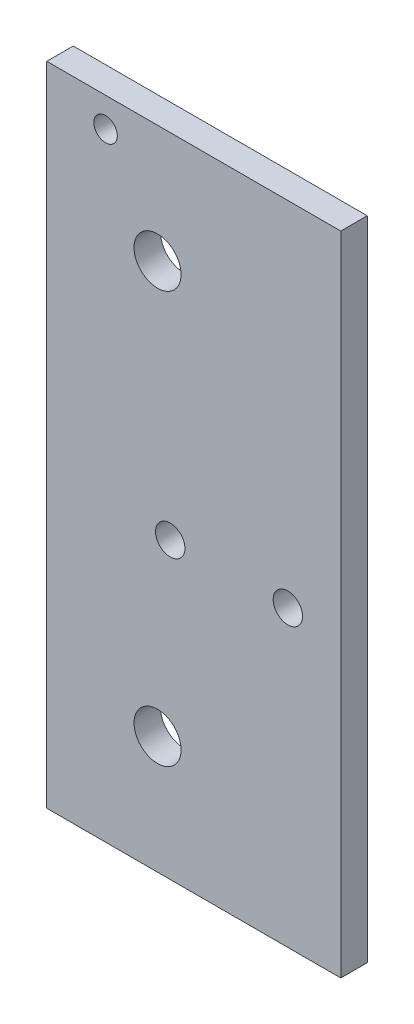
ISO-10303-21;
HEADER;
FILE_DESCRIPTION(('STEP AP214'),'2;1');
FILE_NAME('part.step','',(''),(''),'','','');
FILE_SCHEMA(('AUTOMOTIVE_DESIGN { 1 0 10303 214 1 1 1 1 }'));
ENDSEC;
DATA;
#1=APPLICATION_CONTEXT('core data for automotive mechanical design processes');
#2=APPLICATION_PROTOCOL_DEFINITION('international standard','automotive_design',2000,#1);
#3=PRODUCT_CONTEXT('',#1,'mechanical');
#4=PRODUCT('Part','Part','',(#3));
#5=PRODUCT_RELATED_PRODUCT_CATEGORY('part','',(#4));
#6=PRODUCT_DEFINITION_FORMATION('','',#4);
#7=PRODUCT_DEFINITION_CONTEXT('part definition',#1,'design');
#8=PRODUCT_DEFINITION('design','',#6,#7);
#9=PRODUCT_DEFINITION_SHAPE('','',#8);
#10=(LENGTH_UNIT() NAMED_UNIT(*) SI_UNIT(.MILLI.,.METRE.));
#11=(NAMED_UNIT(*) PLANE_ANGLE_UNIT() SI_UNIT($,.RADIAN.));
#12=(NAMED_UNIT(*) SI_UNIT($,.STERADIAN.) SOLID_ANGLE_UNIT());
#13=UNCERTAINTY_MEASURE_WITH_UNIT(LENGTH_MEASURE(1.E-05),#10,'distance_accuracy_value','');
#14=(GEOMETRIC_REPRESENTATION_CONTEXT(3) GLOBAL_UNCERTAINTY_ASSIGNED_CONTEXT((#13)) GLOBAL_UNIT_ASSIGNED_CONTEXT((#10,
#11,#12)) REPRESENTATION_CONTEXT('',''));
#15=CARTESIAN_POINT('',(0.,0.,0.));
#16=DIRECTION('',(0.,0.,1.));
#17=DIRECTION('',(1.,0.,0.));
#18=AXIS2_PLACEMENT_3D('',#15,#16,#17);
#19=CARTESIAN_POINT('',(0.,0.,4.5));
#20=DIRECTION('',(1.,0.,0.));
#21=DIRECTION('',(0.,0.,-1.));
#22=AXIS2_PLACEMENT_3D('',#19,#20,#21);
#23=PLANE('',#22);
#24=DIRECTION('',(0.,-1.,0.));
#25=VECTOR('',#24,1.);
#26=CARTESIAN_POINT('',(0.,0.,0.));
#27=LINE('',#26,#25);
#28=CARTESIAN_POINT('',(0.,110.,0.));
#29=VERTEX_POINT('',#28);
#30=CARTESIAN_POINT('',(0.,0.,0.));
#31=VERTEX_POINT('',#30);
#32=EDGE_CURVE('E98',#29,#31,#27,.T.);
#33=ORIENTED_EDGE('',*,*,#32,.T.);
#34=DIRECTION('',(0.,0.,-1.));
#35=VECTOR('',#34,1.);
#36=CARTESIAN_POINT('',(0.,0.,4.5));
#37=LINE('',#36,#35);
#38=CARTESIAN_POINT('',(0.,0.,4.5));
#39=VERTEX_POINT('',#38);
#40=EDGE_CURVE('E11',#39,#31,#37,.T.);
#41=ORIENTED_EDGE('',*,*,#40,.F.);
#42=DIRECTION('',(0.,-1.,0.));
#43=VECTOR('',#42,1.);
#44=CARTESIAN_POINT('',(0.,0.,4.5));
#45=LINE('',#44,#43);
#46=CARTESIAN_POINT('',(0.,110.,4.5));
#47=VERTEX_POINT('',#46);
#48=EDGE_CURVE('E85',#47,#39,#45,.T.);
#49=ORIENTED_EDGE('',*,*,#48,.F.);
#50=DIRECTION('',(0.,0.,-1.));
#51=VECTOR('',#50,1.);
#52=CARTESIAN_POINT('',(0.,110.,4.5));
#53=LINE('',#52,#51);
#54=EDGE_CURVE('E94',#47,#29,#53,.T.);
#55=ORIENTED_EDGE('',*,*,#54,.T.);
#56=EDGE_LOOP('',(#33,#41,#49,#55));
#57=FACE_BOUND('',#56,.T.);
#58=ADVANCED_FACE('F33',(#57),#23,.F.);
#59=CARTESIAN_POINT('',(0.,0.,4.5));
#60=DIRECTION('',(0.,1.,0.));
#61=DIRECTION('',(0.,0.,1.));
#62=AXIS2_PLACEMENT_3D('',#59,#60,#61);
#63=PLANE('',#62);
#64=DIRECTION('',(1.,0.,0.));
#65=VECTOR('',#64,1.);
#66=CARTESIAN_POINT('',(0.,0.,0.));
#67=LINE('',#66,#65);
#68=CARTESIAN_POINT('',(50.,0.,0.));
#69=VERTEX_POINT('',#68);
#70=EDGE_CURVE('E89',#31,#69,#67,.T.);
#71=ORIENTED_EDGE('',*,*,#70,.T.);
#72=DIRECTION('',(0.,0.,-1.));
#73=VECTOR('',#72,1.);
#74=CARTESIAN_POINT('',(50.,0.,4.5));
#75=LINE('',#74,#73);
#76=CARTESIAN_POINT('',(50.,0.,4.5));
#77=VERTEX_POINT('',#76);
#78=EDGE_CURVE('E42',#77,#69,#75,.T.);
#79=ORIENTED_EDGE('',*,*,#78,.F.);
#80=DIRECTION('',(1.,0.,0.));
#81=VECTOR('',#80,1.);
#82=CARTESIAN_POINT('',(0.,0.,4.5));
#83=LINE('',#82,#81);
#84=EDGE_CURVE('E80',#39,#77,#83,.T.);
#85=ORIENTED_EDGE('',*,*,#84,.F.);
#86=ORIENTED_EDGE('',*,*,#40,.T.);
#87=EDGE_LOOP('',(#71,#79,#85,#86));
#88=FACE_BOUND('',#87,.T.);
#89=ADVANCED_FACE('F88',(#88),#63,.F.);
#90=CARTESIAN_POINT('',(50.,0.,4.5));
#91=DIRECTION('',(-1.,0.,0.));
#92=DIRECTION('',(0.,0.,1.));
#93=AXIS2_PLACEMENT_3D('',#90,#91,#92);
#94=PLANE('',#93);
#95=DIRECTION('',(0.,1.,0.));
#96=VECTOR('',#95,1.);
#97=CARTESIAN_POINT('',(50.,0.,0.));
#98=LINE('',#97,#96);
#99=CARTESIAN_POINT('',(50.,110.,0.));
#100=VERTEX_POINT('',#99);
#101=EDGE_CURVE('E67',#69,#100,#98,.T.);
#102=ORIENTED_EDGE('',*,*,#101,.T.);
#103=DIRECTION('',(0.,0.,-1.));
#104=VECTOR('',#103,1.);
#105=CARTESIAN_POINT('',(50.,110.,4.5));
#106=LINE('',#105,#104);
#107=CARTESIAN_POINT('',(50.,110.,4.5));
#108=VERTEX_POINT('',#107);
#109=EDGE_CURVE('E90',#108,#100,#106,.T.);
#110=ORIENTED_EDGE('',*,*,#109,.F.);
#111=DIRECTION('',(0.,1.,0.));
#112=VECTOR('',#111,1.);
#113=CARTESIAN_POINT('',(50.,0.,4.5));
#114=LINE('',#113,#112);
#115=EDGE_CURVE('E83',#77,#108,#114,.T.);
#116=ORIENTED_EDGE('',*,*,#115,.F.);
#117=ORIENTED_EDGE('',*,*,#78,.T.);
#118=EDGE_LOOP('',(#102,#110,#116,#117));
#119=FACE_BOUND('',#118,.T.);
#120=ADVANCED_FACE('F92',(#119),#94,.F.);
#121=CARTESIAN_POINT('',(0.,110.,4.5));
#122=DIRECTION('',(0.,-1.,0.));
#123=DIRECTION('',(0.,0.,-1.));
#124=AXIS2_PLACEMENT_3D('',#121,#122,#123);
#125=PLANE('',#124);
#126=DIRECTION('',(-1.,0.,0.));
#127=VECTOR('',#126,1.);
#128=CARTESIAN_POINT('',(0.,110.,0.));
#129=LINE('',#128,#127);
#130=EDGE_CURVE('E73',#100,#29,#129,.T.);
#131=ORIENTED_EDGE('',*,*,#130,.T.);
#132=ORIENTED_EDGE('',*,*,#54,.F.);
#133=DIRECTION('',(-1.,0.,0.));
#134=VECTOR('',#133,1.);
#135=CARTESIAN_POINT('',(0.,110.,4.5));
#136=LINE('',#135,#134);
#137=EDGE_CURVE('E50',#108,#47,#136,.T.);
#138=ORIENTED_EDGE('',*,*,#137,.F.);
#139=ORIENTED_EDGE('',*,*,#109,.T.);
#140=EDGE_LOOP('',(#131,#132,#138,#139));
#141=FACE_BOUND('',#140,.T.);
#142=ADVANCED_FACE('F106',(#141),#125,.F.);
#143=CARTESIAN_POINT('',(0.,0.,4.5));
#144=DIRECTION('',(0.,0.,-1.));
#145=DIRECTION('',(-1.,0.,0.));
#146=AXIS2_PLACEMENT_3D('',#143,#144,#145);
#147=PLANE('',#146);
#148=CARTESIAN_POINT('',(9.99999999999973,104.999999999999,4.5));
#149=DIRECTION('',(0.,0.,1.));
#150=DIRECTION('',(1.,0.,0.));
#151=AXIS2_PLACEMENT_3D('',#148,#149,#150);
#152=CIRCLE('',#151,2.00000000000003);
#153=CARTESIAN_POINT('',(11.9999999999998,104.999999999999,4.5));
#154=VERTEX_POINT('',#153);
#155=EDGE_CURVE('E135',#154,#154,#152,.T.);
#156=ORIENTED_EDGE('',*,*,#155,.F.);
#157=EDGE_LOOP('',(#156));
#158=FACE_BOUND('',#157,.T.);
#159=CARTESIAN_POINT('',(21.,50.,4.5));
#160=DIRECTION('',(0.,0.,1.));
#161=DIRECTION('',(1.,0.,0.));
#162=AXIS2_PLACEMENT_3D('',#159,#160,#161);
#163=CIRCLE('',#162,2.5);
#164=CARTESIAN_POINT('',(23.5,50.,4.5));
#165=VERTEX_POINT('',#164);
#166=EDGE_CURVE('E130',#165,#165,#163,.T.);
#167=ORIENTED_EDGE('',*,*,#166,.F.);
#168=EDGE_LOOP('',(#167));
#169=FACE_BOUND('',#168,.T.);
#170=CARTESIAN_POINT('',(41.,50.,4.5));
#171=DIRECTION('',(0.,0.,1.));
#172=DIRECTION('',(1.,0.,0.));
#173=AXIS2_PLACEMENT_3D('',#170,#171,#172);
#174=CIRCLE('',#173,2.5);
#175=CARTESIAN_POINT('',(43.5,50.,4.5));
#176=VERTEX_POINT('',#175);
#177=EDGE_CURVE('E124',#176,#176,#174,.T.);
#178=ORIENTED_EDGE('',*,*,#177,.F.);
#179=EDGE_LOOP('',(#178));
#180=FACE_BOUND('',#179,.T.);
#181=CARTESIAN_POINT('',(18.84,20.,4.5));
#182=DIRECTION('',(0.,0.,1.));
#183=DIRECTION('',(1.,0.,0.));
#184=AXIS2_PLACEMENT_3D('',#181,#182,#183);
#185=CIRCLE('',#184,4.);
#186=CARTESIAN_POINT('',(22.84,20.,4.5));
#187=VERTEX_POINT('',#186);
#188=EDGE_CURVE('E118',#187,#187,#185,.T.);
#189=ORIENTED_EDGE('',*,*,#188,.F.);
#190=EDGE_LOOP('',(#189));
#191=FACE_BOUND('',#190,.T.);
#192=CARTESIAN_POINT('',(18.84,90.,4.5));
#193=DIRECTION('',(0.,0.,1.));
#194=DIRECTION('',(1.,0.,0.));
#195=AXIS2_PLACEMENT_3D('',#192,#193,#194);
#196=CIRCLE('',#195,4.);
#197=CARTESIAN_POINT('',(22.84,90.,4.5));
#198=VERTEX_POINT('',#197);
#199=EDGE_CURVE('E112',#198,#198,#196,.T.);
#200=ORIENTED_EDGE('',*,*,#199,.F.);
#201=EDGE_LOOP('',(#200));
#202=FACE_BOUND('',#201,.T.);
#203=ORIENTED_EDGE('',*,*,#48,.T.);
#204=ORIENTED_EDGE('',*,*,#84,.T.);
#205=ORIENTED_EDGE('',*,*,#115,.T.);
#206=ORIENTED_EDGE('',*,*,#137,.T.);
#207=EDGE_LOOP('',(#203,#204,#205,#206));
#208=FACE_BOUND('',#207,.T.);
#209=ADVANCED_FACE('F81',(#158,#169,#180,#191,#202,#208),#147,.F.);
#210=CARTESIAN_POINT('',(0.,0.,0.));
#211=DIRECTION('',(0.,0.,-1.));
#212=DIRECTION('',(-1.,0.,0.));
#213=AXIS2_PLACEMENT_3D('',#210,#211,#212);
#214=PLANE('',#213);
#215=CARTESIAN_POINT('',(9.99999999999973,104.999999999999,0.));
#216=DIRECTION('',(0.,0.,-1.));
#217=DIRECTION('',(-1.,0.,0.));
#218=AXIS2_PLACEMENT_3D('',#215,#216,#217);
#219=CIRCLE('',#218,2.00000000000003);
#220=CARTESIAN_POINT('',(7.99999999999971,104.999999999999,0.));
#221=VERTEX_POINT('',#220);
#222=EDGE_CURVE('E36',#221,#221,#219,.T.);
#223=ORIENTED_EDGE('',*,*,#222,.F.);
#224=EDGE_LOOP('',(#223));
#225=FACE_BOUND('',#224,.T.);
#226=CARTESIAN_POINT('',(21.,50.,0.));
#227=DIRECTION('',(0.,0.,1.));
#228=DIRECTION('',(1.,0.,0.));
#229=AXIS2_PLACEMENT_3D('',#226,#227,#228);
#230=CIRCLE('',#229,2.5);
#231=CARTESIAN_POINT('',(23.5,50.,0.));
#232=VERTEX_POINT('',#231);
#233=EDGE_CURVE('E127',#232,#232,#230,.T.);
#234=ORIENTED_EDGE('',*,*,#233,.T.);
#235=EDGE_LOOP('',(#234));
#236=FACE_BOUND('',#235,.T.);
#237=CARTESIAN_POINT('',(41.,50.,0.));
#238=DIRECTION('',(0.,0.,1.));
#239=DIRECTION('',(1.,0.,0.));
#240=AXIS2_PLACEMENT_3D('',#237,#238,#239);
#241=CIRCLE('',#240,2.5);
#242=CARTESIAN_POINT('',(43.5,50.,0.));
#243=VERTEX_POINT('',#242);
#244=EDGE_CURVE('E121',#243,#243,#241,.T.);
#245=ORIENTED_EDGE('',*,*,#244,.T.);
#246=EDGE_LOOP('',(#245));
#247=FACE_BOUND('',#246,.T.);
#248=CARTESIAN_POINT('',(18.84,20.,0.));
#249=DIRECTION('',(0.,0.,1.));
#250=DIRECTION('',(1.,0.,0.));
#251=AXIS2_PLACEMENT_3D('',#248,#249,#250);
#252=CIRCLE('',#251,4.);
#253=CARTESIAN_POINT('',(22.84,20.,0.));
#254=VERTEX_POINT('',#253);
#255=EDGE_CURVE('E115',#254,#254,#252,.T.);
#256=ORIENTED_EDGE('',*,*,#255,.T.);
#257=EDGE_LOOP('',(#256));
#258=FACE_BOUND('',#257,.T.);
#259=CARTESIAN_POINT('',(18.84,90.,0.));
#260=DIRECTION('',(0.,0.,1.));
#261=DIRECTION('',(1.,0.,0.));
#262=AXIS2_PLACEMENT_3D('',#259,#260,#261);
#263=CIRCLE('',#262,4.);
#264=CARTESIAN_POINT('',(22.84,90.,0.));
#265=VERTEX_POINT('',#264);
#266=EDGE_CURVE('E101',#265,#265,#263,.T.);
#267=ORIENTED_EDGE('',*,*,#266,.T.);
#268=EDGE_LOOP('',(#267));
#269=FACE_BOUND('',#268,.T.);
#270=ORIENTED_EDGE('',*,*,#32,.F.);
#271=ORIENTED_EDGE('',*,*,#130,.F.);
#272=ORIENTED_EDGE('',*,*,#101,.F.);
#273=ORIENTED_EDGE('',*,*,#70,.F.);
#274=EDGE_LOOP('',(#270,#271,#272,#273));
#275=FACE_BOUND('',#274,.T.);
#276=ADVANCED_FACE('F109',(#225,#236,#247,#258,#269,#275),#214,.T.);
#277=CARTESIAN_POINT('',(18.84,90.,0.));
#278=DIRECTION('',(0.,0.,1.));
#279=DIRECTION('',(1.,0.,0.));
#280=AXIS2_PLACEMENT_3D('',#277,#278,#279);
#281=CYLINDRICAL_SURFACE('',#280,4.);
#282=ORIENTED_EDGE('',*,*,#266,.F.);
#283=EDGE_LOOP('',(#282));
#284=FACE_BOUND('',#283,.T.);
#285=ORIENTED_EDGE('',*,*,#199,.T.);
#286=EDGE_LOOP('',(#285));
#287=FACE_BOUND('',#286,.T.);
#288=ADVANCED_FACE('F146',(#284,#287),#281,.F.);
#289=CARTESIAN_POINT('',(18.84,20.,0.));
#290=DIRECTION('',(0.,0.,1.));
#291=DIRECTION('',(1.,0.,0.));
#292=AXIS2_PLACEMENT_3D('',#289,#290,#291);
#293=CYLINDRICAL_SURFACE('',#292,4.);
#294=ORIENTED_EDGE('',*,*,#255,.F.);
#295=EDGE_LOOP('',(#294));
#296=FACE_BOUND('',#295,.T.);
#297=ORIENTED_EDGE('',*,*,#188,.T.);
#298=EDGE_LOOP('',(#297));
#299=FACE_BOUND('',#298,.T.);
#300=ADVANCED_FACE('F158',(#296,#299),#293,.F.);
#301=CARTESIAN_POINT('',(41.,50.,0.));
#302=DIRECTION('',(0.,0.,1.));
#303=DIRECTION('',(1.,0.,0.));
#304=AXIS2_PLACEMENT_3D('',#301,#302,#303);
#305=CYLINDRICAL_SURFACE('',#304,2.5);
#306=ORIENTED_EDGE('',*,*,#244,.F.);
#307=EDGE_LOOP('',(#306));
#308=FACE_BOUND('',#307,.T.);
#309=ORIENTED_EDGE('',*,*,#177,.T.);
#310=EDGE_LOOP('',(#309));
#311=FACE_BOUND('',#310,.T.);
#312=ADVANCED_FACE('F206',(#308,#311),#305,.F.);
#313=CARTESIAN_POINT('',(21.,50.,0.));
#314=DIRECTION('',(0.,0.,1.));
#315=DIRECTION('',(1.,0.,0.));
#316=AXIS2_PLACEMENT_3D('',#313,#314,#315);
#317=CYLINDRICAL_SURFACE('',#316,2.5);
#318=ORIENTED_EDGE('',*,*,#233,.F.);
#319=EDGE_LOOP('',(#318));
#320=FACE_BOUND('',#319,.T.);
#321=ORIENTED_EDGE('',*,*,#166,.T.);
#322=EDGE_LOOP('',(#321));
#323=FACE_BOUND('',#322,.T.);
#324=ADVANCED_FACE('F214',(#320,#323),#317,.F.);
#325=CARTESIAN_POINT('',(9.99999999999973,104.999999999999,-5.5));
#326=DIRECTION('',(0.,0.,1.));
#327=DIRECTION('',(1.,0.,0.));
#328=AXIS2_PLACEMENT_3D('',#325,#326,#327);
#329=CYLINDRICAL_SURFACE('',#328,2.00000000000003);
#330=ORIENTED_EDGE('',*,*,#222,.T.);
#331=EDGE_LOOP('',(#330));
#332=FACE_BOUND('',#331,.T.);
#333=ORIENTED_EDGE('',*,*,#155,.T.);
#334=EDGE_LOOP('',(#333));
#335=FACE_BOUND('',#334,.T.);
#336=ADVANCED_FACE('F142',(#332,#335),#329,.F.);
#337=CLOSED_SHELL('',(#58,#89,#120,#142,#209,#276,#288,#300,#312,#324,#336));
#338=MANIFOLD_SOLID_BREP('B2',#337);
#339=ADVANCED_BREP_SHAPE_REPRESENTATION('',(#18,#338),#14);
#340=SHAPE_DEFINITION_REPRESENTATION(#9,#339);
ENDSEC;
END-ISO-10303-21;
